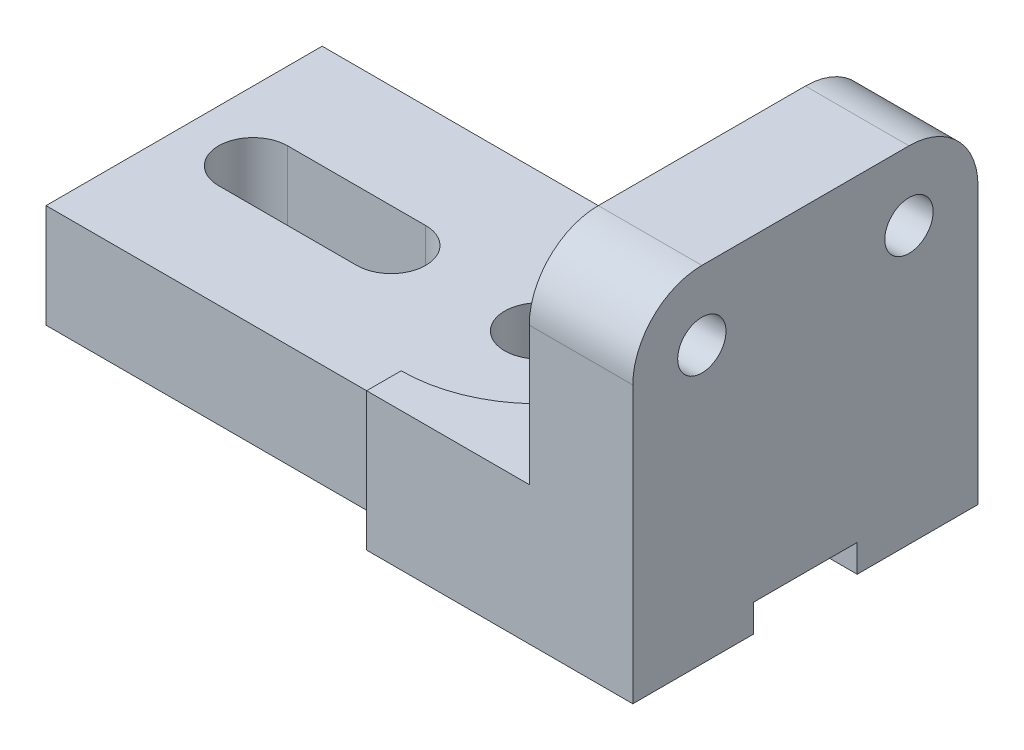
ISO-10303-21;
HEADER;
FILE_DESCRIPTION(('STEP AP214'),'2;1');
FILE_NAME('part.step','',(''),(''),'','','');
FILE_SCHEMA(('AUTOMOTIVE_DESIGN { 1 0 10303 214 1 1 1 1 }'));
ENDSEC;
DATA;
#1=APPLICATION_CONTEXT('core data for automotive mechanical design processes');
#2=APPLICATION_PROTOCOL_DEFINITION('international standard','automotive_design',2000,#1);
#3=PRODUCT_CONTEXT('',#1,'mechanical');
#4=PRODUCT('Part','Part','',(#3));
#5=PRODUCT_RELATED_PRODUCT_CATEGORY('part','',(#4));
#6=PRODUCT_DEFINITION_FORMATION('','',#4);
#7=PRODUCT_DEFINITION_CONTEXT('part definition',#1,'design');
#8=PRODUCT_DEFINITION('design','',#6,#7);
#9=PRODUCT_DEFINITION_SHAPE('','',#8);
#10=(LENGTH_UNIT() NAMED_UNIT(*) SI_UNIT(.MILLI.,.METRE.));
#11=(NAMED_UNIT(*) PLANE_ANGLE_UNIT() SI_UNIT($,.RADIAN.));
#12=(NAMED_UNIT(*) SI_UNIT($,.STERADIAN.) SOLID_ANGLE_UNIT());
#13=UNCERTAINTY_MEASURE_WITH_UNIT(LENGTH_MEASURE(1.E-05),#10,'distance_accuracy_value','');
#14=(GEOMETRIC_REPRESENTATION_CONTEXT(3) GLOBAL_UNCERTAINTY_ASSIGNED_CONTEXT((#13)) GLOBAL_UNIT_ASSIGNED_CONTEXT((#10,
#11,#12)) REPRESENTATION_CONTEXT('',''));
#15=CARTESIAN_POINT('',(0.,0.,0.));
#16=DIRECTION('',(0.,0.,1.));
#17=DIRECTION('',(1.,0.,0.));
#18=AXIS2_PLACEMENT_3D('',#15,#16,#17);
#19=CARTESIAN_POINT('',(-7.11452592101446,-7.39608801955992,50.));
#20=DIRECTION('',(0.,-1.,0.));
#21=DIRECTION('',(1.,0.,0.));
#22=AXIS2_PLACEMENT_3D('',#19,#20,#21);
#23=PLANE('',#22);
#24=DIRECTION('',(-1.,0.,0.));
#25=VECTOR('',#24,1.);
#26=CARTESIAN_POINT('',(0.,-7.39608801955992,5.));
#27=LINE('',#26,#25);
#28=CARTESIAN_POINT('',(-30.6710234566245,-7.39608801955992,5.));
#29=VERTEX_POINT('',#28);
#30=CARTESIAN_POINT('',(-82.1145259210144,-7.39608801955993,5.));
#31=VERTEX_POINT('',#30);
#32=EDGE_CURVE('E327',#29,#31,#27,.T.);
#33=ORIENTED_EDGE('',*,*,#32,.T.);
#34=DIRECTION('',(0.,0.,-1.));
#35=VECTOR('',#34,1.);
#36=CARTESIAN_POINT('',(-82.1145259210144,-7.39608801955993,50.));
#37=LINE('',#36,#35);
#38=CARTESIAN_POINT('',(-82.1145259210144,-7.39608801955993,45.));
#39=VERTEX_POINT('',#38);
#40=EDGE_CURVE('E239',#39,#31,#37,.T.);
#41=ORIENTED_EDGE('',*,*,#40,.F.);
#42=DIRECTION('',(-1.,0.,0.));
#43=VECTOR('',#42,1.);
#44=CARTESIAN_POINT('',(0.,-7.39608801955992,45.));
#45=LINE('',#44,#43);
#46=CARTESIAN_POINT('',(-30.6710234566245,-7.39608801955992,45.));
#47=VERTEX_POINT('',#46);
#48=EDGE_CURVE('E328',#47,#39,#45,.T.);
#49=ORIENTED_EDGE('',*,*,#48,.F.);
#50=CARTESIAN_POINT('',(-30.6710234566245,-7.39608801955992,25.));
#51=DIRECTION('',(0.,-1.,0.));
#52=DIRECTION('',(-1.,0.,0.));
#53=AXIS2_PLACEMENT_3D('',#50,#51,#52);
#54=CIRCLE('',#53,20.);
#55=EDGE_CURVE('E295',#29,#47,#54,.T.);
#56=ORIENTED_EDGE('',*,*,#55,.F.);
#57=EDGE_LOOP('',(#33,#41,#49,#56));
#58=FACE_BOUND('',#57,.T.);
#59=CARTESIAN_POINT('',(-72.1145259210145,-7.39608801955993,25.));
#60=DIRECTION('',(0.,-1.,0.));
#61=DIRECTION('',(1.,0.,0.));
#62=AXIS2_PLACEMENT_3D('',#59,#60,#61);
#63=CIRCLE('',#62,5.);
#64=CARTESIAN_POINT('',(-72.1145259210145,-7.39608801955993,20.));
#65=VERTEX_POINT('',#64);
#66=CARTESIAN_POINT('',(-72.1145259210145,-7.39608801955993,30.));
#67=VERTEX_POINT('',#66);
#68=EDGE_CURVE('E411',#65,#67,#63,.F.);
#69=ORIENTED_EDGE('',*,*,#68,.F.);
#70=DIRECTION('',(-1.,0.,0.));
#71=VECTOR('',#70,1.);
#72=CARTESIAN_POINT('',(-7.11452592101446,-7.39608801955992,20.));
#73=LINE('',#72,#71);
#74=CARTESIAN_POINT('',(-52.1145259210145,-7.39608801955992,20.));
#75=VERTEX_POINT('',#74);
#76=EDGE_CURVE('E419',#75,#65,#73,.T.);
#77=ORIENTED_EDGE('',*,*,#76,.F.);
#78=CARTESIAN_POINT('',(-52.1145259210145,-7.39608801955993,25.));
#79=DIRECTION('',(0.,-1.,0.));
#80=DIRECTION('',(1.,0.,0.));
#81=AXIS2_PLACEMENT_3D('',#78,#79,#80);
#82=CIRCLE('',#81,5.);
#83=CARTESIAN_POINT('',(-52.1145259210145,-7.39608801955993,30.));
#84=VERTEX_POINT('',#83);
#85=EDGE_CURVE('E200',#84,#75,#82,.F.);
#86=ORIENTED_EDGE('',*,*,#85,.F.);
#87=DIRECTION('',(1.,0.,0.));
#88=VECTOR('',#87,1.);
#89=CARTESIAN_POINT('',(-7.11452592101446,-7.39608801955992,30.));
#90=LINE('',#89,#88);
#91=EDGE_CURVE('E414',#67,#84,#90,.T.);
#92=ORIENTED_EDGE('',*,*,#91,.F.);
#93=EDGE_LOOP('',(#69,#77,#86,#92));
#94=FACE_BOUND('',#93,.T.);
#95=CARTESIAN_POINT('',(-30.6710234566245,-7.39608801955993,25.));
#96=DIRECTION('',(0.,-1.,0.));
#97=DIRECTION('',(1.,0.,0.));
#98=AXIS2_PLACEMENT_3D('',#95,#96,#97);
#99=CIRCLE('',#98,5.);
#100=CARTESIAN_POINT('',(-25.6710234566245,-7.39608801955993,25.));
#101=VERTEX_POINT('',#100);
#102=EDGE_CURVE('E401',#101,#101,#99,.F.);
#103=ORIENTED_EDGE('',*,*,#102,.F.);
#104=EDGE_LOOP('',(#103));
#105=FACE_BOUND('',#104,.T.);
#106=ADVANCED_FACE('F45',(#58,#94,#105),#23,.F.);
#107=CARTESIAN_POINT('',(7.88547407898554,-18.3960880195599,17.5));
#108=DIRECTION('',(0.,1.,0.));
#109=DIRECTION('',(0.,0.,1.));
#110=AXIS2_PLACEMENT_3D('',#107,#108,#109);
#111=PLANE('',#110);
#112=DIRECTION('',(0.,0.,-1.));
#113=VECTOR('',#112,1.);
#114=CARTESIAN_POINT('',(-82.1145259210144,-18.3960880195599,17.5));
#115=LINE('',#114,#113);
#116=CARTESIAN_POINT('',(-82.1145259210144,-18.3960880195599,32.5));
#117=VERTEX_POINT('',#116);
#118=CARTESIAN_POINT('',(-82.1145259210144,-18.3960880195599,17.5));
#119=VERTEX_POINT('',#118);
#120=EDGE_CURVE('E369',#117,#119,#115,.T.);
#121=ORIENTED_EDGE('',*,*,#120,.T.);
#122=DIRECTION('',(-1.,0.,0.));
#123=VECTOR('',#122,1.);
#124=CARTESIAN_POINT('',(7.88547407898554,-18.3960880195599,17.5));
#125=LINE('',#124,#123);
#126=CARTESIAN_POINT('',(7.88547407898554,-18.3960880195599,17.5));
#127=VERTEX_POINT('',#126);
#128=EDGE_CURVE('E332',#127,#119,#125,.T.);
#129=ORIENTED_EDGE('',*,*,#128,.F.);
#130=DIRECTION('',(0.,0.,-1.));
#131=VECTOR('',#130,1.);
#132=CARTESIAN_POINT('',(7.88547407898554,-18.3960880195599,17.5));
#133=LINE('',#132,#131);
#134=CARTESIAN_POINT('',(7.88547407898554,-18.3960880195599,32.5));
#135=VERTEX_POINT('',#134);
#136=EDGE_CURVE('E361',#135,#127,#133,.T.);
#137=ORIENTED_EDGE('',*,*,#136,.F.);
#138=DIRECTION('',(-1.,0.,0.));
#139=VECTOR('',#138,1.);
#140=CARTESIAN_POINT('',(7.88547407898554,-18.3960880195599,32.5));
#141=LINE('',#140,#139);
#142=EDGE_CURVE('E364',#135,#117,#141,.T.);
#143=ORIENTED_EDGE('',*,*,#142,.T.);
#144=EDGE_LOOP('',(#121,#129,#137,#143));
#145=FACE_BOUND('',#144,.T.);
#146=CARTESIAN_POINT('',(-72.1145259210145,-18.3960880195599,25.));
#147=DIRECTION('',(0.,1.,0.));
#148=DIRECTION('',(0.,0.,1.));
#149=AXIS2_PLACEMENT_3D('',#146,#147,#148);
#150=CIRCLE('',#149,5.);
#151=CARTESIAN_POINT('',(-72.1145259210145,-18.3960880195599,30.));
#152=VERTEX_POINT('',#151);
#153=CARTESIAN_POINT('',(-72.1145259210145,-18.3960880195599,20.));
#154=VERTEX_POINT('',#153);
#155=EDGE_CURVE('E11',#152,#154,#150,.F.);
#156=ORIENTED_EDGE('',*,*,#155,.F.);
#157=DIRECTION('',(-1.,0.,0.));
#158=VECTOR('',#157,1.);
#159=CARTESIAN_POINT('',(7.88547407898554,-18.3960880195599,30.));
#160=LINE('',#159,#158);
#161=CARTESIAN_POINT('',(-52.1145259210145,-18.3960880195599,30.));
#162=VERTEX_POINT('',#161);
#163=EDGE_CURVE('E55',#162,#152,#160,.T.);
#164=ORIENTED_EDGE('',*,*,#163,.F.);
#165=CARTESIAN_POINT('',(-52.1145259210145,-18.3960880195599,25.));
#166=DIRECTION('',(0.,1.,0.));
#167=DIRECTION('',(0.,0.,1.));
#168=AXIS2_PLACEMENT_3D('',#165,#166,#167);
#169=CIRCLE('',#168,5.);
#170=CARTESIAN_POINT('',(-52.1145259210145,-18.3960880195599,20.));
#171=VERTEX_POINT('',#170);
#172=EDGE_CURVE('E192',#171,#162,#169,.F.);
#173=ORIENTED_EDGE('',*,*,#172,.F.);
#174=DIRECTION('',(1.,0.,0.));
#175=VECTOR('',#174,1.);
#176=CARTESIAN_POINT('',(7.88547407898554,-18.3960880195599,20.));
#177=LINE('',#176,#175);
#178=EDGE_CURVE('E186',#154,#171,#177,.T.);
#179=ORIENTED_EDGE('',*,*,#178,.F.);
#180=EDGE_LOOP('',(#156,#164,#173,#179));
#181=FACE_BOUND('',#180,.T.);
#182=CARTESIAN_POINT('',(-30.6710234566245,-18.3960880195599,25.));
#183=DIRECTION('',(0.,1.,0.));
#184=DIRECTION('',(0.,0.,1.));
#185=AXIS2_PLACEMENT_3D('',#182,#183,#184);
#186=CIRCLE('',#185,5.);
#187=CARTESIAN_POINT('',(-30.6710234566245,-18.3960880195599,30.));
#188=VERTEX_POINT('',#187);
#189=EDGE_CURVE('E49',#188,#188,#186,.F.);
#190=ORIENTED_EDGE('',*,*,#189,.F.);
#191=EDGE_LOOP('',(#190));
#192=FACE_BOUND('',#191,.T.);
#193=ADVANCED_FACE('F206',(#145,#181,#192),#111,.F.);
#194=CARTESIAN_POINT('',(7.88547407898554,-22.3960880195599,50.));
#195=DIRECTION('',(0.,1.,0.));
#196=DIRECTION('',(-1.,0.,0.));
#197=AXIS2_PLACEMENT_3D('',#194,#195,#196);
#198=PLANE('',#197);
#199=DIRECTION('',(0.,0.,-1.));
#200=VECTOR('',#199,1.);
#201=CARTESIAN_POINT('',(7.88547407898554,-22.3960880195599,50.));
#202=LINE('',#201,#200);
#203=CARTESIAN_POINT('',(7.88547407898554,-22.3960880195599,17.5));
#204=VERTEX_POINT('',#203);
#205=CARTESIAN_POINT('',(7.88547407898554,-22.3960880195599,0.));
#206=VERTEX_POINT('',#205);
#207=EDGE_CURVE('E252',#204,#206,#202,.T.);
#208=ORIENTED_EDGE('',*,*,#207,.F.);
#209=DIRECTION('',(-1.,0.,0.));
#210=VECTOR('',#209,1.);
#211=CARTESIAN_POINT('',(7.88547407898554,-22.3960880195599,17.5));
#212=LINE('',#211,#210);
#213=CARTESIAN_POINT('',(-82.1145259210144,-22.3960880195599,17.5));
#214=VERTEX_POINT('',#213);
#215=EDGE_CURVE('E356',#204,#214,#212,.T.);
#216=ORIENTED_EDGE('',*,*,#215,.T.);
#217=DIRECTION('',(0.,0.,-1.));
#218=VECTOR('',#217,1.);
#219=CARTESIAN_POINT('',(-82.1145259210144,-22.3960880195599,50.));
#220=LINE('',#219,#218);
#221=CARTESIAN_POINT('',(-82.1145259210144,-22.3960880195599,5.));
#222=VERTEX_POINT('',#221);
#223=EDGE_CURVE('E247',#214,#222,#220,.T.);
#224=ORIENTED_EDGE('',*,*,#223,.T.);
#225=DIRECTION('',(-1.,0.,0.));
#226=VECTOR('',#225,1.);
#227=CARTESIAN_POINT('',(0.,-22.3960880195599,5.));
#228=LINE('',#227,#226);
#229=CARTESIAN_POINT('',(-30.6710234566245,-22.3960880195599,5.));
#230=VERTEX_POINT('',#229);
#231=EDGE_CURVE('E349',#230,#222,#228,.T.);
#232=ORIENTED_EDGE('',*,*,#231,.F.);
#233=DIRECTION('',(0.,0.,-1.));
#234=VECTOR('',#233,1.);
#235=CARTESIAN_POINT('',(-30.6710234566245,-22.3960880195599,0.));
#236=LINE('',#235,#234);
#237=CARTESIAN_POINT('',(-30.6710234566245,-22.3960880195599,0.));
#238=VERTEX_POINT('',#237);
#239=EDGE_CURVE('E343',#230,#238,#236,.T.);
#240=ORIENTED_EDGE('',*,*,#239,.T.);
#241=DIRECTION('',(1.,0.,0.));
#242=VECTOR('',#241,1.);
#243=CARTESIAN_POINT('',(7.88547407898554,-22.3960880195599,0.));
#244=LINE('',#243,#242);
#245=EDGE_CURVE('E265',#238,#206,#244,.T.);
#246=ORIENTED_EDGE('',*,*,#245,.T.);
#247=EDGE_LOOP('',(#208,#216,#224,#232,#240,#246));
#248=FACE_BOUND('',#247,.T.);
#249=ADVANCED_FACE('F469',(#248),#198,.F.);
#250=CARTESIAN_POINT('',(-82.1145259210144,-22.3960880195599,50.));
#251=DIRECTION('',(1.,0.,0.));
#252=DIRECTION('',(0.,0.,-1.));
#253=AXIS2_PLACEMENT_3D('',#250,#251,#252);
#254=PLANE('',#253);
#255=ORIENTED_EDGE('',*,*,#223,.F.);
#256=DIRECTION('',(0.,-1.,0.));
#257=VECTOR('',#256,1.);
#258=CARTESIAN_POINT('',(-82.1145259210144,-22.3960880195599,17.5));
#259=LINE('',#258,#257);
#260=EDGE_CURVE('E378',#119,#214,#259,.T.);
#261=ORIENTED_EDGE('',*,*,#260,.F.);
#262=ORIENTED_EDGE('',*,*,#120,.F.);
#263=DIRECTION('',(0.,1.,0.));
#264=VECTOR('',#263,1.);
#265=CARTESIAN_POINT('',(-82.1145259210144,-22.3960880195599,32.5));
#266=LINE('',#265,#264);
#267=CARTESIAN_POINT('',(-82.1145259210144,-22.3960880195599,32.5));
#268=VERTEX_POINT('',#267);
#269=EDGE_CURVE('E374',#268,#117,#266,.T.);
#270=ORIENTED_EDGE('',*,*,#269,.F.);
#271=CARTESIAN_POINT('',(-82.1145259210144,-22.3960880195599,45.));
#272=VERTEX_POINT('',#271);
#273=EDGE_CURVE('E243',#272,#268,#220,.T.);
#274=ORIENTED_EDGE('',*,*,#273,.F.);
#275=DIRECTION('',(0.,1.,0.));
#276=VECTOR('',#275,1.);
#277=CARTESIAN_POINT('',(-82.1145259210144,-22.3960880195599,45.));
#278=LINE('',#277,#276);
#279=EDGE_CURVE('E322',#272,#39,#278,.T.);
#280=ORIENTED_EDGE('',*,*,#279,.T.);
#281=ORIENTED_EDGE('',*,*,#40,.T.);
#282=DIRECTION('',(0.,1.,0.));
#283=VECTOR('',#282,1.);
#284=CARTESIAN_POINT('',(-82.1145259210144,-22.3960880195599,5.));
#285=LINE('',#284,#283);
#286=EDGE_CURVE('E300',#222,#31,#285,.T.);
#287=ORIENTED_EDGE('',*,*,#286,.F.);
#288=EDGE_LOOP('',(#255,#261,#262,#270,#274,#280,#281,#287));
#289=FACE_BOUND('',#288,.T.);
#290=ADVANCED_FACE('F524',(#289),#254,.F.);
#291=ORIENTED_EDGE('',*,*,#273,.T.);
#292=DIRECTION('',(-1.,0.,0.));
#293=VECTOR('',#292,1.);
#294=CARTESIAN_POINT('',(7.88547407898554,-22.3960880195599,32.5));
#295=LINE('',#294,#293);
#296=CARTESIAN_POINT('',(7.88547407898554,-22.3960880195599,32.5));
#297=VERTEX_POINT('',#296);
#298=EDGE_CURVE('E360',#297,#268,#295,.T.);
#299=ORIENTED_EDGE('',*,*,#298,.F.);
#300=CARTESIAN_POINT('',(7.88547407898554,-22.3960880195599,50.));
#301=VERTEX_POINT('',#300);
#302=EDGE_CURVE('E248',#301,#297,#202,.T.);
#303=ORIENTED_EDGE('',*,*,#302,.F.);
#304=DIRECTION('',(1.,0.,0.));
#305=VECTOR('',#304,1.);
#306=CARTESIAN_POINT('',(7.88547407898554,-22.3960880195599,50.));
#307=LINE('',#306,#305);
#308=CARTESIAN_POINT('',(-30.6710234566245,-22.3960880195599,50.));
#309=VERTEX_POINT('',#308);
#310=EDGE_CURVE('E276',#309,#301,#307,.T.);
#311=ORIENTED_EDGE('',*,*,#310,.F.);
#312=DIRECTION('',(0.,0.,-1.));
#313=VECTOR('',#312,1.);
#314=CARTESIAN_POINT('',(-30.6710234566245,-22.3960880195599,0.));
#315=LINE('',#314,#313);
#316=CARTESIAN_POINT('',(-30.6710234566245,-22.3960880195599,45.));
#317=VERTEX_POINT('',#316);
#318=EDGE_CURVE('E331',#309,#317,#315,.T.);
#319=ORIENTED_EDGE('',*,*,#318,.T.);
#320=DIRECTION('',(-1.,0.,0.));
#321=VECTOR('',#320,1.);
#322=CARTESIAN_POINT('',(0.,-22.3960880195599,45.));
#323=LINE('',#322,#321);
#324=EDGE_CURVE('E323',#317,#272,#323,.T.);
#325=ORIENTED_EDGE('',*,*,#324,.T.);
#326=EDGE_LOOP('',(#291,#299,#303,#311,#319,#325));
#327=FACE_BOUND('',#326,.T.);
#328=ADVANCED_FACE('F521',(#327),#198,.F.);
#329=CARTESIAN_POINT('',(-7.11452592101446,27.6039119804401,50.));
#330=DIRECTION('',(1.,0.,0.));
#331=DIRECTION('',(0.,1.,0.));
#332=AXIS2_PLACEMENT_3D('',#329,#330,#331);
#333=PLANE('',#332);
#334=CARTESIAN_POINT('',(-7.11452592101446,17.6039119804401,10.));
#335=DIRECTION('',(-1.,0.,0.));
#336=DIRECTION('',(0.,-1.,0.));
#337=AXIS2_PLACEMENT_3D('',#334,#335,#336);
#338=CIRCLE('',#337,3.5);
#339=CARTESIAN_POINT('',(-7.11452592101446,14.1039119804401,10.));
#340=VERTEX_POINT('',#339);
#341=EDGE_CURVE('E396',#340,#340,#338,.T.);
#342=ORIENTED_EDGE('',*,*,#341,.F.);
#343=EDGE_LOOP('',(#342));
#344=FACE_BOUND('',#343,.T.);
#345=CARTESIAN_POINT('',(-7.11452592101446,17.6039119804401,40.));
#346=DIRECTION('',(-1.,0.,0.));
#347=DIRECTION('',(0.,-1.,0.));
#348=AXIS2_PLACEMENT_3D('',#345,#346,#347);
#349=CIRCLE('',#348,3.5);
#350=CARTESIAN_POINT('',(-7.11452592101446,14.1039119804401,40.));
#351=VERTEX_POINT('',#350);
#352=EDGE_CURVE('E392',#351,#351,#349,.T.);
#353=ORIENTED_EDGE('',*,*,#352,.F.);
#354=EDGE_LOOP('',(#353));
#355=FACE_BOUND('',#354,.T.);
#356=DIRECTION('',(0.,-1.,0.));
#357=VECTOR('',#356,1.);
#358=CARTESIAN_POINT('',(-7.11452592101446,27.6039119804401,50.));
#359=LINE('',#358,#357);
#360=CARTESIAN_POINT('',(-7.11452592101446,17.6039119804401,50.));
#361=VERTEX_POINT('',#360);
#362=CARTESIAN_POINT('',(-7.11452592101446,-2.39608801955992,50.));
#363=VERTEX_POINT('',#362);
#364=EDGE_CURVE('E264',#361,#363,#359,.T.);
#365=ORIENTED_EDGE('',*,*,#364,.F.);
#366=CARTESIAN_POINT('',(-7.11452592101446,17.6039119804401,40.));
#367=DIRECTION('',(1.,0.,0.));
#368=DIRECTION('',(0.,1.,0.));
#369=AXIS2_PLACEMENT_3D('',#366,#367,#368);
#370=CIRCLE('',#369,10.);
#371=CARTESIAN_POINT('',(-7.11452592101446,27.6039119804401,40.));
#372=VERTEX_POINT('',#371);
#373=EDGE_CURVE('E218',#361,#372,#370,.F.);
#374=ORIENTED_EDGE('',*,*,#373,.T.);
#375=DIRECTION('',(0.,0.,-1.));
#376=VECTOR('',#375,1.);
#377=CARTESIAN_POINT('',(-7.11452592101446,27.6039119804401,50.));
#378=LINE('',#377,#376);
#379=CARTESIAN_POINT('',(-7.11452592101446,27.6039119804401,10.));
#380=VERTEX_POINT('',#379);
#381=EDGE_CURVE('E256',#372,#380,#378,.T.);
#382=ORIENTED_EDGE('',*,*,#381,.T.);
#383=CARTESIAN_POINT('',(-7.11452592101446,17.6039119804401,10.));
#384=DIRECTION('',(1.,0.,0.));
#385=DIRECTION('',(0.,1.,0.));
#386=AXIS2_PLACEMENT_3D('',#383,#384,#385);
#387=CIRCLE('',#386,10.);
#388=CARTESIAN_POINT('',(-7.11452592101446,17.6039119804401,0.));
#389=VERTEX_POINT('',#388);
#390=EDGE_CURVE('E232',#380,#389,#387,.F.);
#391=ORIENTED_EDGE('',*,*,#390,.T.);
#392=DIRECTION('',(0.,-1.,0.));
#393=VECTOR('',#392,1.);
#394=CARTESIAN_POINT('',(-7.11452592101446,27.6039119804401,0.));
#395=LINE('',#394,#393);
#396=CARTESIAN_POINT('',(-7.11452592101446,-2.39608801955992,0.));
#397=VERTEX_POINT('',#396);
#398=EDGE_CURVE('E269',#389,#397,#395,.T.);
#399=ORIENTED_EDGE('',*,*,#398,.T.);
#400=DIRECTION('',(0.,0.,-1.));
#401=VECTOR('',#400,1.);
#402=CARTESIAN_POINT('',(-7.11452592101446,-2.39608801955992,0.));
#403=LINE('',#402,#401);
#404=EDGE_CURVE('E299',#363,#397,#403,.T.);
#405=ORIENTED_EDGE('',*,*,#404,.F.);
#406=EDGE_LOOP('',(#365,#374,#382,#391,#399,#405));
#407=FACE_BOUND('',#406,.T.);
#408=ADVANCED_FACE('F519',(#344,#355,#407),#333,.F.);
#409=CARTESIAN_POINT('',(7.88547407898554,27.6039119804401,50.));
#410=DIRECTION('',(-1.,0.,0.));
#411=DIRECTION('',(0.,-1.,0.));
#412=AXIS2_PLACEMENT_3D('',#409,#410,#411);
#413=PLANE('',#412);
#414=CARTESIAN_POINT('',(7.88547407898554,17.6039119804401,10.));
#415=DIRECTION('',(-1.,0.,0.));
#416=DIRECTION('',(0.,-1.,0.));
#417=AXIS2_PLACEMENT_3D('',#414,#415,#416);
#418=CIRCLE('',#417,3.5);
#419=CARTESIAN_POINT('',(7.88547407898554,14.1039119804401,10.));
#420=VERTEX_POINT('',#419);
#421=EDGE_CURVE('E381',#420,#420,#418,.F.);
#422=ORIENTED_EDGE('',*,*,#421,.F.);
#423=EDGE_LOOP('',(#422));
#424=FACE_BOUND('',#423,.T.);
#425=CARTESIAN_POINT('',(7.88547407898554,17.6039119804401,40.));
#426=DIRECTION('',(-1.,0.,0.));
#427=DIRECTION('',(0.,-1.,0.));
#428=AXIS2_PLACEMENT_3D('',#425,#426,#427);
#429=CIRCLE('',#428,3.5);
#430=CARTESIAN_POINT('',(7.88547407898554,14.1039119804401,40.));
#431=VERTEX_POINT('',#430);
#432=EDGE_CURVE('E397',#431,#431,#429,.F.);
#433=ORIENTED_EDGE('',*,*,#432,.F.);
#434=EDGE_LOOP('',(#433));
#435=FACE_BOUND('',#434,.T.);
#436=DIRECTION('',(0.,0.,-1.));
#437=VECTOR('',#436,1.);
#438=CARTESIAN_POINT('',(7.88547407898554,27.6039119804401,50.));
#439=LINE('',#438,#437);
#440=CARTESIAN_POINT('',(7.88547407898554,27.6039119804401,40.));
#441=VERTEX_POINT('',#440);
#442=CARTESIAN_POINT('',(7.88547407898554,27.6039119804401,10.));
#443=VERTEX_POINT('',#442);
#444=EDGE_CURVE('E253',#441,#443,#439,.T.);
#445=ORIENTED_EDGE('',*,*,#444,.F.);
#446=CARTESIAN_POINT('',(7.88547407898554,17.6039119804401,40.));
#447=DIRECTION('',(-1.,0.,0.));
#448=DIRECTION('',(0.,-1.,0.));
#449=AXIS2_PLACEMENT_3D('',#446,#447,#448);
#450=CIRCLE('',#449,10.);
#451=CARTESIAN_POINT('',(7.88547407898554,17.6039119804401,50.));
#452=VERTEX_POINT('',#451);
#453=EDGE_CURVE('E193',#441,#452,#450,.F.);
#454=ORIENTED_EDGE('',*,*,#453,.T.);
#455=DIRECTION('',(0.,1.,0.));
#456=VECTOR('',#455,1.);
#457=CARTESIAN_POINT('',(7.88547407898554,27.6039119804401,50.));
#458=LINE('',#457,#456);
#459=EDGE_CURVE('E259',#301,#452,#458,.T.);
#460=ORIENTED_EDGE('',*,*,#459,.F.);
#461=ORIENTED_EDGE('',*,*,#302,.T.);
#462=DIRECTION('',(0.,1.,0.));
#463=VECTOR('',#462,1.);
#464=CARTESIAN_POINT('',(7.88547407898554,-22.3960880195599,32.5));
#465=LINE('',#464,#463);
#466=EDGE_CURVE('E385',#297,#135,#465,.T.);
#467=ORIENTED_EDGE('',*,*,#466,.T.);
#468=ORIENTED_EDGE('',*,*,#136,.T.);
#469=DIRECTION('',(0.,-1.,0.));
#470=VECTOR('',#469,1.);
#471=CARTESIAN_POINT('',(7.88547407898554,-22.3960880195599,17.5));
#472=LINE('',#471,#470);
#473=EDGE_CURVE('E373',#127,#204,#472,.T.);
#474=ORIENTED_EDGE('',*,*,#473,.T.);
#475=ORIENTED_EDGE('',*,*,#207,.T.);
#476=DIRECTION('',(0.,1.,0.));
#477=VECTOR('',#476,1.);
#478=CARTESIAN_POINT('',(7.88547407898554,27.6039119804401,0.));
#479=LINE('',#478,#477);
#480=CARTESIAN_POINT('',(7.88547407898554,17.6039119804401,0.));
#481=VERTEX_POINT('',#480);
#482=EDGE_CURVE('E260',#206,#481,#479,.T.);
#483=ORIENTED_EDGE('',*,*,#482,.T.);
#484=CARTESIAN_POINT('',(7.88547407898554,17.6039119804401,10.));
#485=DIRECTION('',(-1.,0.,0.));
#486=DIRECTION('',(0.,-1.,0.));
#487=AXIS2_PLACEMENT_3D('',#484,#485,#486);
#488=CIRCLE('',#487,10.);
#489=EDGE_CURVE('E225',#481,#443,#488,.F.);
#490=ORIENTED_EDGE('',*,*,#489,.T.);
#491=EDGE_LOOP('',(#445,#454,#460,#461,#467,#468,#474,#475,#483,#490));
#492=FACE_BOUND('',#491,.T.);
#493=ADVANCED_FACE('F515',(#424,#435,#492),#413,.F.);
#494=CARTESIAN_POINT('',(-7.11452592101446,27.6039119804401,50.));
#495=DIRECTION('',(0.,-1.,0.));
#496=DIRECTION('',(1.,0.,0.));
#497=AXIS2_PLACEMENT_3D('',#494,#495,#496);
#498=PLANE('',#497);
#499=ORIENTED_EDGE('',*,*,#381,.F.);
#500=DIRECTION('',(-1.,0.,0.));
#501=VECTOR('',#500,1.);
#502=CARTESIAN_POINT('',(-7.11452592101446,27.6039119804401,40.));
#503=LINE('',#502,#501);
#504=EDGE_CURVE('E215',#372,#441,#503,.F.);
#505=ORIENTED_EDGE('',*,*,#504,.T.);
#506=ORIENTED_EDGE('',*,*,#444,.T.);
#507=DIRECTION('',(-1.,0.,0.));
#508=VECTOR('',#507,1.);
#509=CARTESIAN_POINT('',(-7.11452592101446,27.6039119804401,10.));
#510=LINE('',#509,#508);
#511=EDGE_CURVE('E235',#443,#380,#510,.T.);
#512=ORIENTED_EDGE('',*,*,#511,.T.);
#513=EDGE_LOOP('',(#499,#505,#506,#512));
#514=FACE_BOUND('',#513,.T.);
#515=ADVANCED_FACE('F508',(#514),#498,.F.);
#516=CARTESIAN_POINT('',(0.,0.,50.));
#517=DIRECTION('',(0.,0.,-1.));
#518=DIRECTION('',(-1.,0.,0.));
#519=AXIS2_PLACEMENT_3D('',#516,#517,#518);
#520=PLANE('',#519);
#521=ORIENTED_EDGE('',*,*,#459,.T.);
#522=DIRECTION('',(-1.,0.,0.));
#523=VECTOR('',#522,1.);
#524=CARTESIAN_POINT('',(0.,17.6039119804401,50.));
#525=LINE('',#524,#523);
#526=EDGE_CURVE('E221',#452,#361,#525,.T.);
#527=ORIENTED_EDGE('',*,*,#526,.T.);
#528=ORIENTED_EDGE('',*,*,#364,.T.);
#529=DIRECTION('',(1.,0.,0.));
#530=VECTOR('',#529,1.);
#531=CARTESIAN_POINT('',(-7.11452592101446,-2.39608801955992,50.));
#532=LINE('',#531,#530);
#533=CARTESIAN_POINT('',(-30.6710234566245,-2.39608801955992,50.));
#534=VERTEX_POINT('',#533);
#535=EDGE_CURVE('E294',#534,#363,#532,.T.);
#536=ORIENTED_EDGE('',*,*,#535,.F.);
#537=DIRECTION('',(0.,-1.,0.));
#538=VECTOR('',#537,1.);
#539=CARTESIAN_POINT('',(-30.6710234566245,-2.39608801955992,50.));
#540=LINE('',#539,#538);
#541=EDGE_CURVE('E291',#534,#309,#540,.T.);
#542=ORIENTED_EDGE('',*,*,#541,.T.);
#543=ORIENTED_EDGE('',*,*,#310,.T.);
#544=EDGE_LOOP('',(#521,#527,#528,#536,#542,#543));
#545=FACE_BOUND('',#544,.T.);
#546=ADVANCED_FACE('F505',(#545),#520,.F.);
#547=CARTESIAN_POINT('',(0.,0.,0.));
#548=DIRECTION('',(0.,0.,-1.));
#549=DIRECTION('',(-1.,0.,0.));
#550=AXIS2_PLACEMENT_3D('',#547,#548,#549);
#551=PLANE('',#550);
#552=ORIENTED_EDGE('',*,*,#398,.F.);
#553=DIRECTION('',(-1.,0.,0.));
#554=VECTOR('',#553,1.);
#555=CARTESIAN_POINT('',(7.88547407898554,17.6039119804401,0.));
#556=LINE('',#555,#554);
#557=EDGE_CURVE('E229',#389,#481,#556,.F.);
#558=ORIENTED_EDGE('',*,*,#557,.T.);
#559=ORIENTED_EDGE('',*,*,#482,.F.);
#560=ORIENTED_EDGE('',*,*,#245,.F.);
#561=DIRECTION('',(0.,-1.,0.));
#562=VECTOR('',#561,1.);
#563=CARTESIAN_POINT('',(-30.6710234566245,-2.39608801955992,0.));
#564=LINE('',#563,#562);
#565=CARTESIAN_POINT('',(-30.6710234566245,-2.39608801955992,0.));
#566=VERTEX_POINT('',#565);
#567=EDGE_CURVE('E272',#566,#238,#564,.T.);
#568=ORIENTED_EDGE('',*,*,#567,.F.);
#569=DIRECTION('',(-1.,0.,0.));
#570=VECTOR('',#569,1.);
#571=CARTESIAN_POINT('',(-7.11452592101446,-2.39608801955992,0.));
#572=LINE('',#571,#570);
#573=EDGE_CURVE('E313',#397,#566,#572,.T.);
#574=ORIENTED_EDGE('',*,*,#573,.F.);
#575=EDGE_LOOP('',(#552,#558,#559,#560,#568,#574));
#576=FACE_BOUND('',#575,.T.);
#577=ADVANCED_FACE('F503',(#576),#551,.T.);
#578=CARTESIAN_POINT('',(-30.6710234566245,-2.39608801955992,0.));
#579=DIRECTION('',(1.,0.,0.));
#580=DIRECTION('',(0.,1.,0.));
#581=AXIS2_PLACEMENT_3D('',#578,#579,#580);
#582=PLANE('',#581);
#583=ORIENTED_EDGE('',*,*,#567,.T.);
#584=ORIENTED_EDGE('',*,*,#239,.F.);
#585=DIRECTION('',(0.,1.,0.));
#586=VECTOR('',#585,1.);
#587=CARTESIAN_POINT('',(-30.6710234566245,-22.3960880195599,5.));
#588=LINE('',#587,#586);
#589=EDGE_CURVE('E339',#230,#29,#588,.T.);
#590=ORIENTED_EDGE('',*,*,#589,.T.);
#591=DIRECTION('',(0.,-1.,0.));
#592=VECTOR('',#591,1.);
#593=CARTESIAN_POINT('',(-30.6710234566245,-2.39608801955992,5.));
#594=LINE('',#593,#592);
#595=CARTESIAN_POINT('',(-30.6710234566245,-2.39608801955992,5.));
#596=VERTEX_POINT('',#595);
#597=EDGE_CURVE('E283',#596,#29,#594,.T.);
#598=ORIENTED_EDGE('',*,*,#597,.F.);
#599=DIRECTION('',(0.,0.,1.));
#600=VECTOR('',#599,1.);
#601=CARTESIAN_POINT('',(-30.6710234566245,-2.39608801955992,0.));
#602=LINE('',#601,#600);
#603=EDGE_CURVE('E310',#566,#596,#602,.T.);
#604=ORIENTED_EDGE('',*,*,#603,.F.);
#605=EDGE_LOOP('',(#583,#584,#590,#598,#604));
#606=FACE_BOUND('',#605,.T.);
#607=ADVANCED_FACE('F499',(#606),#582,.F.);
#608=CARTESIAN_POINT('',(-30.6710234566245,-2.39608801955992,25.));
#609=DIRECTION('',(0.,-1.,0.));
#610=DIRECTION('',(1.,0.,0.));
#611=AXIS2_PLACEMENT_3D('',#608,#609,#610);
#612=CYLINDRICAL_SURFACE('',#611,20.);
#613=ORIENTED_EDGE('',*,*,#55,.T.);
#614=DIRECTION('',(0.,-1.,0.));
#615=VECTOR('',#614,1.);
#616=CARTESIAN_POINT('',(-30.6710234566245,-2.39608801955992,45.));
#617=LINE('',#616,#615);
#618=CARTESIAN_POINT('',(-30.6710234566245,-2.39608801955992,45.));
#619=VERTEX_POINT('',#618);
#620=EDGE_CURVE('E287',#619,#47,#617,.T.);
#621=ORIENTED_EDGE('',*,*,#620,.F.);
#622=CARTESIAN_POINT('',(-30.6710234566245,-2.39608801955992,25.));
#623=DIRECTION('',(0.,-1.,0.));
#624=DIRECTION('',(-1.,0.,0.));
#625=AXIS2_PLACEMENT_3D('',#622,#623,#624);
#626=CIRCLE('',#625,20.);
#627=EDGE_CURVE('E307',#596,#619,#626,.T.);
#628=ORIENTED_EDGE('',*,*,#627,.F.);
#629=ORIENTED_EDGE('',*,*,#597,.T.);
#630=EDGE_LOOP('',(#613,#621,#628,#629));
#631=FACE_BOUND('',#630,.T.);
#632=ADVANCED_FACE('F495',(#631),#612,.F.);
#633=CARTESIAN_POINT('',(-30.6710234566245,-2.39608801955992,45.));
#634=DIRECTION('',(1.,0.,0.));
#635=DIRECTION('',(0.,1.,0.));
#636=AXIS2_PLACEMENT_3D('',#633,#634,#635);
#637=PLANE('',#636);
#638=ORIENTED_EDGE('',*,*,#620,.T.);
#639=DIRECTION('',(0.,1.,0.));
#640=VECTOR('',#639,1.);
#641=CARTESIAN_POINT('',(-30.6710234566245,-22.3960880195599,45.));
#642=LINE('',#641,#640);
#643=EDGE_CURVE('E319',#317,#47,#642,.T.);
#644=ORIENTED_EDGE('',*,*,#643,.F.);
#645=ORIENTED_EDGE('',*,*,#318,.F.);
#646=ORIENTED_EDGE('',*,*,#541,.F.);
#647=DIRECTION('',(0.,0.,1.));
#648=VECTOR('',#647,1.);
#649=CARTESIAN_POINT('',(-30.6710234566245,-2.39608801955992,45.));
#650=LINE('',#649,#648);
#651=EDGE_CURVE('E304',#619,#534,#650,.T.);
#652=ORIENTED_EDGE('',*,*,#651,.F.);
#653=EDGE_LOOP('',(#638,#644,#645,#646,#652));
#654=FACE_BOUND('',#653,.T.);
#655=ADVANCED_FACE('F491',(#654),#637,.F.);
#656=CARTESIAN_POINT('',(-30.6710234566245,-2.39608801955992,25.));
#657=DIRECTION('',(0.,1.,0.));
#658=DIRECTION('',(-1.,0.,0.));
#659=AXIS2_PLACEMENT_3D('',#656,#657,#658);
#660=PLANE('',#659);
#661=ORIENTED_EDGE('',*,*,#404,.T.);
#662=ORIENTED_EDGE('',*,*,#573,.T.);
#663=ORIENTED_EDGE('',*,*,#603,.T.);
#664=ORIENTED_EDGE('',*,*,#627,.T.);
#665=ORIENTED_EDGE('',*,*,#651,.T.);
#666=ORIENTED_EDGE('',*,*,#535,.T.);
#667=EDGE_LOOP('',(#661,#662,#663,#664,#665,#666));
#668=FACE_BOUND('',#667,.T.);
#669=ADVANCED_FACE('F487',(#668),#660,.T.);
#670=CARTESIAN_POINT('',(0.,-22.3960880195599,45.));
#671=DIRECTION('',(0.,0.,-1.));
#672=DIRECTION('',(-1.,0.,0.));
#673=AXIS2_PLACEMENT_3D('',#670,#671,#672);
#674=PLANE('',#673);
#675=ORIENTED_EDGE('',*,*,#48,.T.);
#676=ORIENTED_EDGE('',*,*,#279,.F.);
#677=ORIENTED_EDGE('',*,*,#324,.F.);
#678=ORIENTED_EDGE('',*,*,#643,.T.);
#679=EDGE_LOOP('',(#675,#676,#677,#678));
#680=FACE_BOUND('',#679,.T.);
#681=ADVANCED_FACE('F483',(#680),#674,.F.);
#682=CARTESIAN_POINT('',(0.,-22.3960880195599,5.));
#683=DIRECTION('',(0.,0.,-1.));
#684=DIRECTION('',(-1.,0.,0.));
#685=AXIS2_PLACEMENT_3D('',#682,#683,#684);
#686=PLANE('',#685);
#687=ORIENTED_EDGE('',*,*,#32,.F.);
#688=ORIENTED_EDGE('',*,*,#589,.F.);
#689=ORIENTED_EDGE('',*,*,#231,.T.);
#690=ORIENTED_EDGE('',*,*,#286,.T.);
#691=EDGE_LOOP('',(#687,#688,#689,#690));
#692=FACE_BOUND('',#691,.T.);
#693=ADVANCED_FACE('F479',(#692),#686,.T.);
#694=CARTESIAN_POINT('',(7.88547407898554,-22.3960880195599,17.5));
#695=DIRECTION('',(0.,0.,-1.));
#696=DIRECTION('',(-1.,0.,0.));
#697=AXIS2_PLACEMENT_3D('',#694,#695,#696);
#698=PLANE('',#697);
#699=ORIENTED_EDGE('',*,*,#260,.T.);
#700=ORIENTED_EDGE('',*,*,#215,.F.);
#701=ORIENTED_EDGE('',*,*,#473,.F.);
#702=ORIENTED_EDGE('',*,*,#128,.T.);
#703=EDGE_LOOP('',(#699,#700,#701,#702));
#704=FACE_BOUND('',#703,.T.);
#705=ADVANCED_FACE('F475',(#704),#698,.F.);
#706=CARTESIAN_POINT('',(7.88547407898554,-22.3960880195599,32.5));
#707=DIRECTION('',(0.,0.,1.));
#708=DIRECTION('',(1.,0.,0.));
#709=AXIS2_PLACEMENT_3D('',#706,#707,#708);
#710=PLANE('',#709);
#711=ORIENTED_EDGE('',*,*,#269,.T.);
#712=ORIENTED_EDGE('',*,*,#142,.F.);
#713=ORIENTED_EDGE('',*,*,#466,.F.);
#714=ORIENTED_EDGE('',*,*,#298,.T.);
#715=EDGE_LOOP('',(#711,#712,#713,#714));
#716=FACE_BOUND('',#715,.T.);
#717=ADVANCED_FACE('F471',(#716),#710,.F.);
#718=CARTESIAN_POINT('',(-7.11452592101446,17.6039119804401,10.));
#719=DIRECTION('',(1.,0.,0.));
#720=DIRECTION('',(0.,1.,0.));
#721=AXIS2_PLACEMENT_3D('',#718,#719,#720);
#722=CYLINDRICAL_SURFACE('',#721,10.);
#723=ORIENTED_EDGE('',*,*,#489,.F.);
#724=ORIENTED_EDGE('',*,*,#557,.F.);
#725=ORIENTED_EDGE('',*,*,#390,.F.);
#726=ORIENTED_EDGE('',*,*,#511,.F.);
#727=EDGE_LOOP('',(#723,#724,#725,#726));
#728=FACE_BOUND('',#727,.T.);
#729=ADVANCED_FACE('F474',(#728),#722,.T.);
#730=CARTESIAN_POINT('',(0.,17.6039119804401,40.));
#731=DIRECTION('',(-1.,0.,0.));
#732=DIRECTION('',(0.,-1.,0.));
#733=AXIS2_PLACEMENT_3D('',#730,#731,#732);
#734=CYLINDRICAL_SURFACE('',#733,10.);
#735=ORIENTED_EDGE('',*,*,#453,.F.);
#736=ORIENTED_EDGE('',*,*,#504,.F.);
#737=ORIENTED_EDGE('',*,*,#373,.F.);
#738=ORIENTED_EDGE('',*,*,#526,.F.);
#739=EDGE_LOOP('',(#735,#736,#737,#738));
#740=FACE_BOUND('',#739,.T.);
#741=ADVANCED_FACE('F47',(#740),#734,.T.);
#742=CARTESIAN_POINT('',(7.88647407898554,17.6039119804401,40.));
#743=DIRECTION('',(-1.,0.,0.));
#744=DIRECTION('',(0.,-1.,0.));
#745=AXIS2_PLACEMENT_3D('',#742,#743,#744);
#746=CYLINDRICAL_SURFACE('',#745,3.5);
#747=CARTESIAN_POINT('',(-7.11452592101446,14.1039119804401,40.));
#748=CARTESIAN_POINT('',(-6.95827592101446,14.1039119804401,40.));
#749=CARTESIAN_POINT('',(-6.80202592101446,14.1039119804401,40.));
#750=CARTESIAN_POINT('',(-6.48952592101446,14.1039119804401,40.));
#751=CARTESIAN_POINT('',(-6.33327592101446,14.1039119804401,40.));
#752=CARTESIAN_POINT('',(-6.02077592101446,14.1039119804401,40.));
#753=CARTESIAN_POINT('',(-5.86452592101446,14.1039119804401,40.));
#754=CARTESIAN_POINT('',(-5.55202592101446,14.1039119804401,40.));
#755=CARTESIAN_POINT('',(-5.39577592101446,14.1039119804401,40.));
#756=CARTESIAN_POINT('',(-5.08327592101446,14.1039119804401,40.));
#757=CARTESIAN_POINT('',(-4.92702592101446,14.1039119804401,40.));
#758=CARTESIAN_POINT('',(-4.61452592101446,14.1039119804401,40.));
#759=CARTESIAN_POINT('',(-4.45827592101446,14.1039119804401,40.));
#760=CARTESIAN_POINT('',(-4.14577592101446,14.1039119804401,40.));
#761=CARTESIAN_POINT('',(-3.98952592101446,14.1039119804401,40.));
#762=CARTESIAN_POINT('',(-3.67702592101446,14.1039119804401,40.));
#763=CARTESIAN_POINT('',(-3.52077592101446,14.1039119804401,40.));
#764=CARTESIAN_POINT('',(-3.20827592101446,14.1039119804401,40.));
#765=CARTESIAN_POINT('',(-3.05202592101446,14.1039119804401,40.));
#766=CARTESIAN_POINT('',(-2.73952592101446,14.1039119804401,40.));
#767=CARTESIAN_POINT('',(-2.58327592101446,14.1039119804401,40.));
#768=CARTESIAN_POINT('',(-2.27077592101446,14.1039119804401,40.));
#769=CARTESIAN_POINT('',(-2.11452592101446,14.1039119804401,40.));
#770=CARTESIAN_POINT('',(-1.80202592101446,14.1039119804401,40.));
#771=CARTESIAN_POINT('',(-1.64577592101446,14.1039119804401,40.));
#772=CARTESIAN_POINT('',(-1.33327592101446,14.1039119804401,40.));
#773=CARTESIAN_POINT('',(-1.17702592101446,14.1039119804401,40.));
#774=CARTESIAN_POINT('',(-0.864525921014459,14.1039119804401,40.));
#775=CARTESIAN_POINT('',(-0.708275921014459,14.1039119804401,40.));
#776=CARTESIAN_POINT('',(-0.395775921014459,14.1039119804401,40.));
#777=CARTESIAN_POINT('',(-0.239525921014459,14.1039119804401,40.));
#778=CARTESIAN_POINT('',(0.07297407898554,14.1039119804401,40.));
#779=CARTESIAN_POINT('',(0.22922407898554,14.1039119804401,40.));
#780=CARTESIAN_POINT('',(0.54172407898554,14.1039119804401,40.));
#781=CARTESIAN_POINT('',(0.69797407898554,14.1039119804401,40.));
#782=CARTESIAN_POINT('',(1.01047407898554,14.1039119804401,40.));
#783=CARTESIAN_POINT('',(1.16672407898554,14.1039119804401,40.));
#784=CARTESIAN_POINT('',(1.47922407898554,14.1039119804401,40.));
#785=CARTESIAN_POINT('',(1.63547407898554,14.1039119804401,40.));
#786=CARTESIAN_POINT('',(1.94797407898554,14.1039119804401,40.));
#787=CARTESIAN_POINT('',(2.10422407898554,14.1039119804401,40.));
#788=CARTESIAN_POINT('',(2.41672407898554,14.1039119804401,40.));
#789=CARTESIAN_POINT('',(2.57297407898554,14.1039119804401,40.));
#790=CARTESIAN_POINT('',(2.88547407898554,14.1039119804401,40.));
#791=CARTESIAN_POINT('',(3.04172407898554,14.1039119804401,40.));
#792=CARTESIAN_POINT('',(3.35422407898554,14.1039119804401,40.));
#793=CARTESIAN_POINT('',(3.51047407898554,14.1039119804401,40.));
#794=CARTESIAN_POINT('',(3.82297407898554,14.1039119804401,40.));
#795=CARTESIAN_POINT('',(3.97922407898554,14.1039119804401,40.));
#796=CARTESIAN_POINT('',(4.29172407898554,14.1039119804401,40.));
#797=CARTESIAN_POINT('',(4.44797407898554,14.1039119804401,40.));
#798=CARTESIAN_POINT('',(4.76047407898554,14.1039119804401,40.));
#799=CARTESIAN_POINT('',(4.91672407898554,14.1039119804401,40.));
#800=CARTESIAN_POINT('',(5.22922407898554,14.1039119804401,40.));
#801=CARTESIAN_POINT('',(5.38547407898554,14.1039119804401,40.));
#802=CARTESIAN_POINT('',(5.69797407898554,14.1039119804401,40.));
#803=CARTESIAN_POINT('',(5.85422407898554,14.1039119804401,40.));
#804=CARTESIAN_POINT('',(6.16672407898554,14.1039119804401,40.));
#805=CARTESIAN_POINT('',(6.32297407898554,14.1039119804401,40.));
#806=CARTESIAN_POINT('',(6.63547407898554,14.1039119804401,40.));
#807=CARTESIAN_POINT('',(6.79172407898554,14.1039119804401,40.));
#808=CARTESIAN_POINT('',(7.10422407898554,14.1039119804401,40.));
#809=CARTESIAN_POINT('',(7.26047407898554,14.1039119804401,40.));
#810=CARTESIAN_POINT('',(7.57297407898554,14.1039119804401,40.));
#811=CARTESIAN_POINT('',(7.72922407898554,14.1039119804401,40.));
#812=CARTESIAN_POINT('',(7.88547407898554,14.1039119804401,40.));
#813=B_SPLINE_CURVE_WITH_KNOTS('',3,(#747,#748,#749,#750,#751,#752,#753,#754,#755,#756,#757,
#758,#759,#760,#761,#762,#763,#764,#765,#766,#767,#768,#769,#770,#771,#772,#773,#774,#775,#776,
#777,#778,#779,#780,#781,#782,#783,#784,#785,#786,#787,#788,#789,#790,#791,#792,#793,#794,#795,
#796,#797,#798,#799,#800,#801,#802,#803,#804,#805,#806,#807,#808,#809,#810,#811,#812),
.UNSPECIFIED.,.F.,.F.,(4,2,2,2,2,2,2,2,2,2,2,2,2,2,2,2,2,2,2,2,2,2,2,2,2,2,2,2,2,2,2,2,4),(0.,
0.46875,0.937500000000001,1.40625,1.875,2.34375,2.8125,3.28125,3.75,4.21875,4.6875,5.15625,
5.625,6.09375,6.5625,7.03125,7.5,7.96875,8.4375,8.90625,9.375,9.84375,10.3125,10.78125,11.25,
11.71875,12.1875,12.65625,13.125,13.59375,14.0625,14.53125,15.),.UNSPECIFIED.);
#814=EDGE_CURVE('BSEAM462',#351,#431,#813,.T.);
#815=ORIENTED_EDGE('',*,*,#352,.T.);
#816=ORIENTED_EDGE('',*,*,#432,.T.);
#817=ORIENTED_EDGE('',*,*,#814,.T.);
#818=ORIENTED_EDGE('',*,*,#814,.F.);
#819=EDGE_LOOP('',(#815,#817,#816,#818));
#820=FACE_BOUND('',#819,.T.);
#821=ADVANCED_FACE('F462',(#820),#746,.F.);
#822=CARTESIAN_POINT('',(7.88647407898554,17.6039119804401,10.));
#823=DIRECTION('',(-1.,0.,0.));
#824=DIRECTION('',(0.,-1.,0.));
#825=AXIS2_PLACEMENT_3D('',#822,#823,#824);
#826=CYLINDRICAL_SURFACE('',#825,3.5);
#827=CARTESIAN_POINT('',(-7.11452592101446,14.1039119804401,10.));
#828=CARTESIAN_POINT('',(-6.95827592101446,14.1039119804401,10.));
#829=CARTESIAN_POINT('',(-6.80202592101446,14.1039119804401,10.));
#830=CARTESIAN_POINT('',(-6.48952592101446,14.1039119804401,10.));
#831=CARTESIAN_POINT('',(-6.33327592101446,14.1039119804401,10.));
#832=CARTESIAN_POINT('',(-6.02077592101446,14.1039119804401,10.));
#833=CARTESIAN_POINT('',(-5.86452592101446,14.1039119804401,10.));
#834=CARTESIAN_POINT('',(-5.55202592101446,14.1039119804401,10.));
#835=CARTESIAN_POINT('',(-5.39577592101446,14.1039119804401,10.));
#836=CARTESIAN_POINT('',(-5.08327592101446,14.1039119804401,10.));
#837=CARTESIAN_POINT('',(-4.92702592101446,14.1039119804401,10.));
#838=CARTESIAN_POINT('',(-4.61452592101446,14.1039119804401,10.));
#839=CARTESIAN_POINT('',(-4.45827592101446,14.1039119804401,10.));
#840=CARTESIAN_POINT('',(-4.14577592101446,14.1039119804401,10.));
#841=CARTESIAN_POINT('',(-3.98952592101446,14.1039119804401,10.));
#842=CARTESIAN_POINT('',(-3.67702592101446,14.1039119804401,10.));
#843=CARTESIAN_POINT('',(-3.52077592101446,14.1039119804401,10.));
#844=CARTESIAN_POINT('',(-3.20827592101446,14.1039119804401,10.));
#845=CARTESIAN_POINT('',(-3.05202592101446,14.1039119804401,10.));
#846=CARTESIAN_POINT('',(-2.73952592101446,14.1039119804401,10.));
#847=CARTESIAN_POINT('',(-2.58327592101446,14.1039119804401,10.));
#848=CARTESIAN_POINT('',(-2.27077592101446,14.1039119804401,10.));
#849=CARTESIAN_POINT('',(-2.11452592101446,14.1039119804401,10.));
#850=CARTESIAN_POINT('',(-1.80202592101446,14.1039119804401,10.));
#851=CARTESIAN_POINT('',(-1.64577592101446,14.1039119804401,10.));
#852=CARTESIAN_POINT('',(-1.33327592101446,14.1039119804401,10.));
#853=CARTESIAN_POINT('',(-1.17702592101446,14.1039119804401,10.));
#854=CARTESIAN_POINT('',(-0.864525921014459,14.1039119804401,10.));
#855=CARTESIAN_POINT('',(-0.708275921014459,14.1039119804401,10.));
#856=CARTESIAN_POINT('',(-0.395775921014459,14.1039119804401,10.));
#857=CARTESIAN_POINT('',(-0.239525921014459,14.1039119804401,10.));
#858=CARTESIAN_POINT('',(0.07297407898554,14.1039119804401,10.));
#859=CARTESIAN_POINT('',(0.22922407898554,14.1039119804401,10.));
#860=CARTESIAN_POINT('',(0.54172407898554,14.1039119804401,10.));
#861=CARTESIAN_POINT('',(0.69797407898554,14.1039119804401,10.));
#862=CARTESIAN_POINT('',(1.01047407898554,14.1039119804401,10.));
#863=CARTESIAN_POINT('',(1.16672407898554,14.1039119804401,10.));
#864=CARTESIAN_POINT('',(1.47922407898554,14.1039119804401,10.));
#865=CARTESIAN_POINT('',(1.63547407898554,14.1039119804401,10.));
#866=CARTESIAN_POINT('',(1.94797407898554,14.1039119804401,10.));
#867=CARTESIAN_POINT('',(2.10422407898554,14.1039119804401,10.));
#868=CARTESIAN_POINT('',(2.41672407898554,14.1039119804401,10.));
#869=CARTESIAN_POINT('',(2.57297407898554,14.1039119804401,10.));
#870=CARTESIAN_POINT('',(2.88547407898554,14.1039119804401,10.));
#871=CARTESIAN_POINT('',(3.04172407898554,14.1039119804401,10.));
#872=CARTESIAN_POINT('',(3.35422407898554,14.1039119804401,10.));
#873=CARTESIAN_POINT('',(3.51047407898554,14.1039119804401,10.));
#874=CARTESIAN_POINT('',(3.82297407898554,14.1039119804401,10.));
#875=CARTESIAN_POINT('',(3.97922407898554,14.1039119804401,10.));
#876=CARTESIAN_POINT('',(4.29172407898554,14.1039119804401,10.));
#877=CARTESIAN_POINT('',(4.44797407898554,14.1039119804401,10.));
#878=CARTESIAN_POINT('',(4.76047407898554,14.1039119804401,10.));
#879=CARTESIAN_POINT('',(4.91672407898554,14.1039119804401,10.));
#880=CARTESIAN_POINT('',(5.22922407898554,14.1039119804401,10.));
#881=CARTESIAN_POINT('',(5.38547407898554,14.1039119804401,10.));
#882=CARTESIAN_POINT('',(5.69797407898554,14.1039119804401,10.));
#883=CARTESIAN_POINT('',(5.85422407898554,14.1039119804401,10.));
#884=CARTESIAN_POINT('',(6.16672407898554,14.1039119804401,10.));
#885=CARTESIAN_POINT('',(6.32297407898554,14.1039119804401,10.));
#886=CARTESIAN_POINT('',(6.63547407898554,14.1039119804401,10.));
#887=CARTESIAN_POINT('',(6.79172407898554,14.1039119804401,10.));
#888=CARTESIAN_POINT('',(7.10422407898554,14.1039119804401,10.));
#889=CARTESIAN_POINT('',(7.26047407898554,14.1039119804401,10.));
#890=CARTESIAN_POINT('',(7.57297407898554,14.1039119804401,10.));
#891=CARTESIAN_POINT('',(7.72922407898554,14.1039119804401,10.));
#892=CARTESIAN_POINT('',(7.88547407898554,14.1039119804401,10.));
#893=B_SPLINE_CURVE_WITH_KNOTS('',3,(#827,#828,#829,#830,#831,#832,#833,#834,#835,#836,#837,
#838,#839,#840,#841,#842,#843,#844,#845,#846,#847,#848,#849,#850,#851,#852,#853,#854,#855,#856,
#857,#858,#859,#860,#861,#862,#863,#864,#865,#866,#867,#868,#869,#870,#871,#872,#873,#874,#875,
#876,#877,#878,#879,#880,#881,#882,#883,#884,#885,#886,#887,#888,#889,#890,#891,#892),
.UNSPECIFIED.,.F.,.F.,(4,2,2,2,2,2,2,2,2,2,2,2,2,2,2,2,2,2,2,2,2,2,2,2,2,2,2,2,2,2,2,2,4),(0.,
0.46875,0.937500000000001,1.40625,1.875,2.34375,2.8125,3.28125,3.75,4.21875,4.6875,5.15625,
5.625,6.09375,6.5625,7.03125,7.5,7.96875,8.4375,8.90625,9.375,9.84375,10.3125,10.78125,11.25,
11.71875,12.1875,12.65625,13.125,13.59375,14.0625,14.53125,15.),.UNSPECIFIED.);
#894=EDGE_CURVE('BSEAM455',#340,#420,#893,.T.);
#895=ORIENTED_EDGE('',*,*,#341,.T.);
#896=ORIENTED_EDGE('',*,*,#421,.T.);
#897=ORIENTED_EDGE('',*,*,#894,.T.);
#898=ORIENTED_EDGE('',*,*,#894,.F.);
#899=EDGE_LOOP('',(#895,#897,#896,#898));
#900=FACE_BOUND('',#899,.T.);
#901=ADVANCED_FACE('F455',(#900),#826,.F.);
#902=CARTESIAN_POINT('',(-72.1145259210145,27.6039119804401,25.));
#903=DIRECTION('',(0.,-1.,0.));
#904=DIRECTION('',(1.,0.,0.));
#905=AXIS2_PLACEMENT_3D('',#902,#903,#904);
#906=CYLINDRICAL_SURFACE('',#905,5.);
#907=ORIENTED_EDGE('',*,*,#68,.T.);
#908=DIRECTION('',(0.,-1.,0.));
#909=VECTOR('',#908,1.);
#910=CARTESIAN_POINT('',(-72.1145259210145,27.6039119804401,30.));
#911=LINE('',#910,#909);
#912=EDGE_CURVE('E426',#67,#152,#911,.T.);
#913=ORIENTED_EDGE('',*,*,#912,.T.);
#914=ORIENTED_EDGE('',*,*,#155,.T.);
#915=DIRECTION('',(0.,-1.,0.));
#916=VECTOR('',#915,1.);
#917=CARTESIAN_POINT('',(-72.1145259210145,27.6039119804401,20.));
#918=LINE('',#917,#916);
#919=EDGE_CURVE('E67',#65,#154,#918,.T.);
#920=ORIENTED_EDGE('',*,*,#919,.F.);
#921=EDGE_LOOP('',(#907,#913,#914,#920));
#922=FACE_BOUND('',#921,.T.);
#923=ADVANCED_FACE('F431',(#922),#906,.F.);
#924=CARTESIAN_POINT('',(-72.1145259210145,27.6039119804401,30.));
#925=DIRECTION('',(0.,0.,-1.));
#926=DIRECTION('',(-1.,0.,0.));
#927=AXIS2_PLACEMENT_3D('',#924,#925,#926);
#928=PLANE('',#927);
#929=ORIENTED_EDGE('',*,*,#91,.T.);
#930=DIRECTION('',(0.,-1.,0.));
#931=VECTOR('',#930,1.);
#932=CARTESIAN_POINT('',(-52.1145259210145,27.6039119804401,30.));
#933=LINE('',#932,#931);
#934=EDGE_CURVE('E203',#84,#162,#933,.T.);
#935=ORIENTED_EDGE('',*,*,#934,.T.);
#936=ORIENTED_EDGE('',*,*,#163,.T.);
#937=ORIENTED_EDGE('',*,*,#912,.F.);
#938=EDGE_LOOP('',(#929,#935,#936,#937));
#939=FACE_BOUND('',#938,.T.);
#940=ADVANCED_FACE('F435',(#939),#928,.T.);
#941=CARTESIAN_POINT('',(-52.1145259210145,27.6039119804401,25.));
#942=DIRECTION('',(0.,-1.,0.));
#943=DIRECTION('',(1.,0.,0.));
#944=AXIS2_PLACEMENT_3D('',#941,#942,#943);
#945=CYLINDRICAL_SURFACE('',#944,5.);
#946=ORIENTED_EDGE('',*,*,#85,.T.);
#947=DIRECTION('',(0.,-1.,0.));
#948=VECTOR('',#947,1.);
#949=CARTESIAN_POINT('',(-52.1145259210145,27.6039119804401,20.));
#950=LINE('',#949,#948);
#951=EDGE_CURVE('E62',#75,#171,#950,.T.);
#952=ORIENTED_EDGE('',*,*,#951,.T.);
#953=ORIENTED_EDGE('',*,*,#172,.T.);
#954=ORIENTED_EDGE('',*,*,#934,.F.);
#955=EDGE_LOOP('',(#946,#952,#953,#954));
#956=FACE_BOUND('',#955,.T.);
#957=ADVANCED_FACE('F196',(#956),#945,.F.);
#958=CARTESIAN_POINT('',(-72.1145259210145,27.6039119804401,20.));
#959=DIRECTION('',(0.,0.,1.));
#960=DIRECTION('',(1.,0.,0.));
#961=AXIS2_PLACEMENT_3D('',#958,#959,#960);
#962=PLANE('',#961);
#963=ORIENTED_EDGE('',*,*,#76,.T.);
#964=ORIENTED_EDGE('',*,*,#919,.T.);
#965=ORIENTED_EDGE('',*,*,#178,.T.);
#966=ORIENTED_EDGE('',*,*,#951,.F.);
#967=EDGE_LOOP('',(#963,#964,#965,#966));
#968=FACE_BOUND('',#967,.T.);
#969=ADVANCED_FACE('F187',(#968),#962,.T.);
#970=CARTESIAN_POINT('',(-30.6710234566245,27.6039119804401,25.));
#971=DIRECTION('',(0.,-1.,0.));
#972=DIRECTION('',(1.,0.,0.));
#973=AXIS2_PLACEMENT_3D('',#970,#971,#972);
#974=CYLINDRICAL_SURFACE('',#973,5.);
#975=ORIENTED_EDGE('',*,*,#189,.T.);
#976=EDGE_LOOP('',(#975));
#977=FACE_BOUND('',#976,.T.);
#978=ORIENTED_EDGE('',*,*,#102,.T.);
#979=EDGE_LOOP('',(#978));
#980=FACE_BOUND('',#979,.T.);
#981=ADVANCED_FACE('F443',(#977,#980),#974,.F.);
#982=CLOSED_SHELL('',(#106,#193,#249,#290,#328,#408,#493,#515,#546,#577,#607,#632,#655,#669,
#681,#693,#705,#717,#729,#741,#821,#901,#923,#940,#957,#969,#981));
#983=MANIFOLD_SOLID_BREP('B2',#982);
#984=ADVANCED_BREP_SHAPE_REPRESENTATION('',(#18,#983),#14);
#985=SHAPE_DEFINITION_REPRESENTATION(#9,#984);
ENDSEC;
END-ISO-10303-21;
